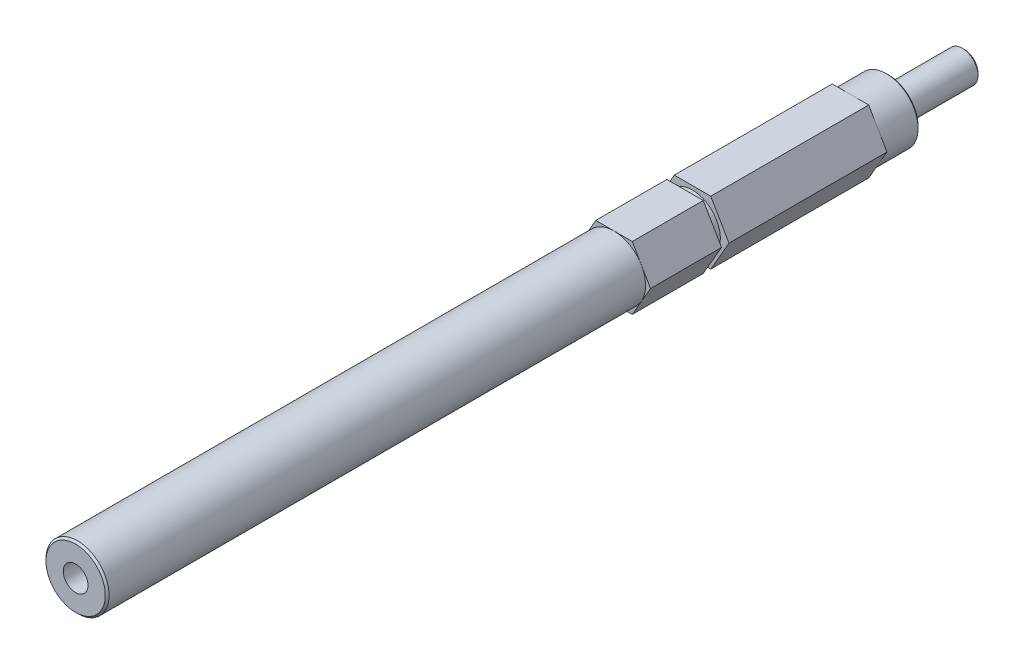
ISO-10303-21;
HEADER;
FILE_DESCRIPTION(('STEP AP214'),'2;1');
FILE_NAME('part.step','',(''),(''),'','','');
FILE_SCHEMA(('AUTOMOTIVE_DESIGN { 1 0 10303 214 1 1 1 1 }'));
ENDSEC;
DATA;
#1=APPLICATION_CONTEXT('core data for automotive mechanical design processes');
#2=APPLICATION_PROTOCOL_DEFINITION('international standard','automotive_design',2000,#1);
#3=PRODUCT_CONTEXT('',#1,'mechanical');
#4=PRODUCT('Part','Part','',(#3));
#5=PRODUCT_RELATED_PRODUCT_CATEGORY('part','',(#4));
#6=PRODUCT_DEFINITION_FORMATION('','',#4);
#7=PRODUCT_DEFINITION_CONTEXT('part definition',#1,'design');
#8=PRODUCT_DEFINITION('design','',#6,#7);
#9=PRODUCT_DEFINITION_SHAPE('','',#8);
#10=(LENGTH_UNIT() NAMED_UNIT(*) SI_UNIT(.MILLI.,.METRE.));
#11=(NAMED_UNIT(*) PLANE_ANGLE_UNIT() SI_UNIT($,.RADIAN.));
#12=(NAMED_UNIT(*) SI_UNIT($,.STERADIAN.) SOLID_ANGLE_UNIT());
#13=UNCERTAINTY_MEASURE_WITH_UNIT(LENGTH_MEASURE(1.E-05),#10,'distance_accuracy_value','');
#14=(GEOMETRIC_REPRESENTATION_CONTEXT(3) GLOBAL_UNCERTAINTY_ASSIGNED_CONTEXT((#13)) GLOBAL_UNIT_ASSIGNED_CONTEXT((#10,
#11,#12)) REPRESENTATION_CONTEXT('',''));
#15=CARTESIAN_POINT('',(0.,0.,0.));
#16=DIRECTION('',(0.,0.,1.));
#17=DIRECTION('',(1.,0.,0.));
#18=AXIS2_PLACEMENT_3D('',#15,#16,#17);
#19=CARTESIAN_POINT('',(9.05330995064486,0.,-22.86));
#20=DIRECTION('',(0.,0.,1.));
#21=DIRECTION('',(1.,0.,0.));
#22=AXIS2_PLACEMENT_3D('',#19,#20,#21);
#23=PLANE('',#22);
#24=CARTESIAN_POINT('',(9.05330995064486,0.,-22.860000000037));
#25=DIRECTION('',(0.,0.,1.));
#26=DIRECTION('',(1.,0.,0.));
#27=AXIS2_PLACEMENT_3D('',#24,#25,#26);
#28=CIRCLE('',#27,2.76859999993877);
#29=CARTESIAN_POINT('',(11.8219099505836,0.,-22.860000000037));
#30=VERTEX_POINT('',#29);
#31=EDGE_CURVE('E20',#30,#30,#28,.T.);
#32=ORIENTED_EDGE('',*,*,#31,.F.);
#33=EDGE_LOOP('',(#32));
#34=FACE_BOUND('',#33,.T.);
#35=ADVANCED_FACE('F17',(#34),#23,.F.);
#36=CARTESIAN_POINT('',(9.05330995064486,0.,-22.4790000000326));
#37=DIRECTION('',(0.,0.,1.));
#38=DIRECTION('',(1.,0.,0.));
#39=AXIS2_PLACEMENT_3D('',#36,#37,#38);
#40=CONICAL_SURFACE('',#39,3.14959999994318,0.785398163397448);
#41=CARTESIAN_POINT('',(9.05330995064486,0.,-22.479));
#42=DIRECTION('',(0.,0.,-1.));
#43=DIRECTION('',(-1.,0.,0.));
#44=AXIS2_PLACEMENT_3D('',#41,#42,#43);
#45=CIRCLE('',#44,3.1496);
#46=CARTESIAN_POINT('',(5.90370995064486,0.,-22.479));
#47=VERTEX_POINT('',#46);
#48=EDGE_CURVE('E159',#47,#47,#45,.F.);
#49=ORIENTED_EDGE('',*,*,#48,.F.);
#50=EDGE_LOOP('',(#49));
#51=FACE_BOUND('',#50,.T.);
#52=ORIENTED_EDGE('',*,*,#31,.T.);
#53=EDGE_LOOP('',(#52));
#54=FACE_BOUND('',#53,.T.);
#55=ADVANCED_FACE('F353',(#51,#54),#40,.T.);
#56=CARTESIAN_POINT('',(9.05330995064486,0.,-22.86));
#57=DIRECTION('',(0.,0.,-1.));
#58=DIRECTION('',(-1.,0.,0.));
#59=AXIS2_PLACEMENT_3D('',#56,#57,#58);
#60=CYLINDRICAL_SURFACE('',#59,3.1496);
#61=CARTESIAN_POINT('',(9.05330995064486,0.,-7.62));
#62=DIRECTION('',(0.,0.,-1.));
#63=DIRECTION('',(-1.,0.,0.));
#64=AXIS2_PLACEMENT_3D('',#61,#62,#63);
#65=CIRCLE('',#64,3.1496);
#66=CARTESIAN_POINT('',(5.90370995064486,0.,-7.62));
#67=VERTEX_POINT('',#66);
#68=EDGE_CURVE('E162',#67,#67,#65,.T.);
#69=ORIENTED_EDGE('',*,*,#68,.T.);
#70=EDGE_LOOP('',(#69));
#71=FACE_BOUND('',#70,.T.);
#72=ORIENTED_EDGE('',*,*,#48,.T.);
#73=EDGE_LOOP('',(#72));
#74=FACE_BOUND('',#73,.T.);
#75=ADVANCED_FACE('F338',(#71,#74),#60,.T.);
#76=CARTESIAN_POINT('',(9.05330995064486,0.,-7.62));
#77=DIRECTION('',(0.,0.,1.));
#78=DIRECTION('',(1.,0.,0.));
#79=AXIS2_PLACEMENT_3D('',#76,#77,#78);
#80=PLANE('',#79);
#81=CARTESIAN_POINT('',(9.05330995064486,0.,-7.61999999997443));
#82=DIRECTION('',(0.,0.,1.));
#83=DIRECTION('',(1.,0.,0.));
#84=AXIS2_PLACEMENT_3D('',#81,#82,#83);
#85=CIRCLE('',#84,5.96264999998613);
#86=CARTESIAN_POINT('',(15.015959950631,0.,-7.61999999997443));
#87=VERTEX_POINT('',#86);
#88=EDGE_CURVE('E156',#87,#87,#85,.T.);
#89=ORIENTED_EDGE('',*,*,#88,.F.);
#90=EDGE_LOOP('',(#89));
#91=FACE_BOUND('',#90,.T.);
#92=ORIENTED_EDGE('',*,*,#68,.F.);
#93=EDGE_LOOP('',(#92));
#94=FACE_BOUND('',#93,.T.);
#95=ADVANCED_FACE('F341',(#91,#94),#80,.F.);
#96=CARTESIAN_POINT('',(9.05330995064486,0.,-7.23899999997002));
#97=DIRECTION('',(0.,0.,1.));
#98=DIRECTION('',(1.,0.,0.));
#99=AXIS2_PLACEMENT_3D('',#96,#97,#98);
#100=CONICAL_SURFACE('',#99,6.34364999999053,0.785398163397448);
#101=CARTESIAN_POINT('',(9.05330995064486,0.,-7.239));
#102=DIRECTION('',(0.,0.,-1.));
#103=DIRECTION('',(-1.,0.,0.));
#104=AXIS2_PLACEMENT_3D('',#101,#102,#103);
#105=CIRCLE('',#104,6.34365);
#106=CARTESIAN_POINT('',(2.70965995064486,0.,-7.239));
#107=VERTEX_POINT('',#106);
#108=EDGE_CURVE('E153',#107,#107,#105,.F.);
#109=ORIENTED_EDGE('',*,*,#108,.F.);
#110=EDGE_LOOP('',(#109));
#111=FACE_BOUND('',#110,.T.);
#112=ORIENTED_EDGE('',*,*,#88,.T.);
#113=EDGE_LOOP('',(#112));
#114=FACE_BOUND('',#113,.T.);
#115=ADVANCED_FACE('F343',(#111,#114),#100,.T.);
#116=CARTESIAN_POINT('',(9.05330995064486,0.,-7.62));
#117=DIRECTION('',(0.,0.,-1.));
#118=DIRECTION('',(-1.,0.,0.));
#119=AXIS2_PLACEMENT_3D('',#116,#117,#118);
#120=CYLINDRICAL_SURFACE('',#119,6.34365);
#121=CARTESIAN_POINT('',(9.05330995064486,0.,0.));
#122=DIRECTION('',(0.,0.,-1.));
#123=DIRECTION('',(-1.,0.,0.));
#124=AXIS2_PLACEMENT_3D('',#121,#122,#123);
#125=CIRCLE('',#124,6.34365);
#126=CARTESIAN_POINT('',(2.70965995064486,0.,0.));
#127=VERTEX_POINT('',#126);
#128=EDGE_CURVE('E135',#127,#127,#125,.T.);
#129=ORIENTED_EDGE('',*,*,#128,.T.);
#130=EDGE_LOOP('',(#129));
#131=FACE_BOUND('',#130,.T.);
#132=ORIENTED_EDGE('',*,*,#108,.T.);
#133=EDGE_LOOP('',(#132));
#134=FACE_BOUND('',#133,.T.);
#135=ADVANCED_FACE('F350',(#131,#134),#120,.T.);
#136=CARTESIAN_POINT('',(12.719484159999,6.35,0.));
#137=DIRECTION('',(0.,0.,1.));
#138=DIRECTION('',(1.,0.,0.));
#139=AXIS2_PLACEMENT_3D('',#136,#137,#138);
#140=PLANE('',#139);
#141=DIRECTION('',(-0.499999999999999,-0.866025403784439,0.));
#142=VECTOR('',#141,1.);
#143=CARTESIAN_POINT('',(12.719484159999,-6.35000000000001,0.));
#144=LINE('',#143,#142);
#145=CARTESIAN_POINT('',(16.3856583693531,0.,0.));
#146=VERTEX_POINT('',#145);
#147=CARTESIAN_POINT('',(12.719484159999,-6.35000000000001,0.));
#148=VERTEX_POINT('',#147);
#149=EDGE_CURVE('E124',#146,#148,#144,.T.);
#150=ORIENTED_EDGE('',*,*,#149,.T.);
#151=DIRECTION('',(1.,0.,0.));
#152=VECTOR('',#151,1.);
#153=CARTESIAN_POINT('',(5.38713574129074,-6.35000000000001,0.));
#154=LINE('',#153,#152);
#155=CARTESIAN_POINT('',(5.38713574129074,-6.35000000000001,0.));
#156=VERTEX_POINT('',#155);
#157=EDGE_CURVE('E144',#148,#156,#154,.F.);
#158=ORIENTED_EDGE('',*,*,#157,.T.);
#159=DIRECTION('',(-0.499999999999999,0.866025403784439,0.));
#160=VECTOR('',#159,1.);
#161=CARTESIAN_POINT('',(1.72096153193662,0.,0.));
#162=LINE('',#161,#160);
#163=CARTESIAN_POINT('',(1.72096153193662,0.,0.));
#164=VERTEX_POINT('',#163);
#165=EDGE_CURVE('E297',#156,#164,#162,.T.);
#166=ORIENTED_EDGE('',*,*,#165,.T.);
#167=DIRECTION('',(0.499999999999999,0.866025403784439,0.));
#168=VECTOR('',#167,1.);
#169=CARTESIAN_POINT('',(5.38713574129074,6.34999999999999,0.));
#170=LINE('',#169,#168);
#171=CARTESIAN_POINT('',(5.38713574129074,6.35,0.));
#172=VERTEX_POINT('',#171);
#173=EDGE_CURVE('E292',#164,#172,#170,.T.);
#174=ORIENTED_EDGE('',*,*,#173,.T.);
#175=DIRECTION('',(1.,0.,0.));
#176=VECTOR('',#175,1.);
#177=CARTESIAN_POINT('',(12.719484159999,6.35,0.));
#178=LINE('',#177,#176);
#179=CARTESIAN_POINT('',(12.719484159999,6.35,0.));
#180=VERTEX_POINT('',#179);
#181=EDGE_CURVE('E132',#172,#180,#178,.T.);
#182=ORIENTED_EDGE('',*,*,#181,.T.);
#183=DIRECTION('',(0.499999999999999,-0.866025403784439,0.));
#184=VECTOR('',#183,1.);
#185=CARTESIAN_POINT('',(16.3856583693531,0.,0.));
#186=LINE('',#185,#184);
#187=EDGE_CURVE('E127',#180,#146,#186,.T.);
#188=ORIENTED_EDGE('',*,*,#187,.T.);
#189=EDGE_LOOP('',(#150,#158,#166,#174,#182,#188));
#190=FACE_BOUND('',#189,.T.);
#191=ORIENTED_EDGE('',*,*,#128,.F.);
#192=EDGE_LOOP('',(#191));
#193=FACE_BOUND('',#192,.T.);
#194=ADVANCED_FACE('F129',(#190,#193),#140,.F.);
#195=CARTESIAN_POINT('',(16.3856583693531,0.,47.5234));
#196=DIRECTION('',(-0.866025403784439,-0.499999999999999,0.));
#197=DIRECTION('',(0.499999999999999,-0.866025403784439,0.));
#198=AXIS2_PLACEMENT_3D('',#195,#196,#197);
#199=PLANE('',#198);
#200=DIRECTION('',(0.499999999999998,-0.86602540378444,0.));
#201=VECTOR('',#200,1.);
#202=CARTESIAN_POINT('',(12.719484159999,6.35,31.75));
#203=LINE('',#202,#201);
#204=CARTESIAN_POINT('',(12.719484159999,6.34999999999999,31.75));
#205=VERTEX_POINT('',#204);
#206=CARTESIAN_POINT('',(16.3856583693531,0.,31.75));
#207=VERTEX_POINT('',#206);
#208=EDGE_CURVE('E141',#205,#207,#203,.T.);
#209=ORIENTED_EDGE('',*,*,#208,.T.);
#210=DIRECTION('',(0.,0.,1.));
#211=VECTOR('',#210,1.);
#212=CARTESIAN_POINT('',(16.3856583693531,0.,47.5234));
#213=LINE('',#212,#211);
#214=EDGE_CURVE('E138',#207,#146,#213,.F.);
#215=ORIENTED_EDGE('',*,*,#214,.T.);
#216=ORIENTED_EDGE('',*,*,#187,.F.);
#217=DIRECTION('',(0.,0.,1.));
#218=VECTOR('',#217,1.);
#219=CARTESIAN_POINT('',(12.719484159999,6.35,47.5234));
#220=LINE('',#219,#218);
#221=EDGE_CURVE('E286',#180,#205,#220,.T.);
#222=ORIENTED_EDGE('',*,*,#221,.T.);
#223=EDGE_LOOP('',(#209,#215,#216,#222));
#224=FACE_BOUND('',#223,.T.);
#225=ADVANCED_FACE('F139',(#224),#199,.F.);
#226=CARTESIAN_POINT('',(12.719484159999,-6.35000000000001,47.5234));
#227=DIRECTION('',(-0.866025403784439,0.499999999999999,0.));
#228=DIRECTION('',(-0.499999999999999,-0.866025403784439,0.));
#229=AXIS2_PLACEMENT_3D('',#226,#227,#228);
#230=PLANE('',#229);
#231=DIRECTION('',(-0.499999999999996,-0.866025403784441,0.));
#232=VECTOR('',#231,1.);
#233=CARTESIAN_POINT('',(16.3856583693531,0.,31.75));
#234=LINE('',#233,#232);
#235=CARTESIAN_POINT('',(12.719484159999,-6.35000000000001,31.75));
#236=VERTEX_POINT('',#235);
#237=EDGE_CURVE('E280',#207,#236,#234,.T.);
#238=ORIENTED_EDGE('',*,*,#237,.T.);
#239=DIRECTION('',(0.,0.,1.));
#240=VECTOR('',#239,1.);
#241=CARTESIAN_POINT('',(12.719484159999,-6.35000000000001,47.5234));
#242=LINE('',#241,#240);
#243=EDGE_CURVE('E148',#236,#148,#242,.F.);
#244=ORIENTED_EDGE('',*,*,#243,.T.);
#245=ORIENTED_EDGE('',*,*,#149,.F.);
#246=ORIENTED_EDGE('',*,*,#214,.F.);
#247=EDGE_LOOP('',(#238,#244,#245,#246));
#248=FACE_BOUND('',#247,.T.);
#249=ADVANCED_FACE('F146',(#248),#230,.F.);
#250=CARTESIAN_POINT('',(5.38713574129074,-6.35000000000001,47.5234));
#251=DIRECTION('',(0.,1.,0.));
#252=DIRECTION('',(0.,0.,1.));
#253=AXIS2_PLACEMENT_3D('',#250,#251,#252);
#254=PLANE('',#253);
#255=DIRECTION('',(-1.,0.,0.));
#256=VECTOR('',#255,1.);
#257=CARTESIAN_POINT('',(42.9726315789473,-6.35000000000001,31.75));
#258=LINE('',#257,#256);
#259=CARTESIAN_POINT('',(5.38713574129074,-6.35000000000001,31.75));
#260=VERTEX_POINT('',#259);
#261=EDGE_CURVE('E278',#236,#260,#258,.T.);
#262=ORIENTED_EDGE('',*,*,#261,.T.);
#263=DIRECTION('',(0.,0.,1.));
#264=VECTOR('',#263,1.);
#265=CARTESIAN_POINT('',(5.38713574129074,-6.35000000000001,47.5234));
#266=LINE('',#265,#264);
#267=EDGE_CURVE('E294',#260,#156,#266,.F.);
#268=ORIENTED_EDGE('',*,*,#267,.T.);
#269=ORIENTED_EDGE('',*,*,#157,.F.);
#270=ORIENTED_EDGE('',*,*,#243,.F.);
#271=EDGE_LOOP('',(#262,#268,#269,#270));
#272=FACE_BOUND('',#271,.T.);
#273=ADVANCED_FACE('F302',(#272),#254,.F.);
#274=CARTESIAN_POINT('',(1.72096153193662,0.,47.5234));
#275=DIRECTION('',(0.866025403784439,0.499999999999999,0.));
#276=DIRECTION('',(-0.499999999999999,0.866025403784439,0.));
#277=AXIS2_PLACEMENT_3D('',#274,#275,#276);
#278=PLANE('',#277);
#279=DIRECTION('',(-0.499999999999999,0.866025403784439,0.));
#280=VECTOR('',#279,1.);
#281=CARTESIAN_POINT('',(5.38713574129074,-6.35000000000001,31.75));
#282=LINE('',#281,#280);
#283=CARTESIAN_POINT('',(1.72096153193662,0.,31.75));
#284=VERTEX_POINT('',#283);
#285=EDGE_CURVE('E276',#260,#284,#282,.T.);
#286=ORIENTED_EDGE('',*,*,#285,.T.);
#287=DIRECTION('',(0.,0.,1.));
#288=VECTOR('',#287,1.);
#289=CARTESIAN_POINT('',(1.72096153193662,0.,47.5234));
#290=LINE('',#289,#288);
#291=EDGE_CURVE('E289',#284,#164,#290,.F.);
#292=ORIENTED_EDGE('',*,*,#291,.T.);
#293=ORIENTED_EDGE('',*,*,#165,.F.);
#294=ORIENTED_EDGE('',*,*,#267,.F.);
#295=EDGE_LOOP('',(#286,#292,#293,#294));
#296=FACE_BOUND('',#295,.T.);
#297=ADVANCED_FACE('F306',(#296),#278,.F.);
#298=CARTESIAN_POINT('',(5.38713574129074,6.34999999999999,47.5234));
#299=DIRECTION('',(0.866025403784439,-0.499999999999999,0.));
#300=DIRECTION('',(0.499999999999999,0.866025403784439,0.));
#301=AXIS2_PLACEMENT_3D('',#298,#299,#300);
#302=PLANE('',#301);
#303=DIRECTION('',(0.5,0.866025403784439,0.));
#304=VECTOR('',#303,1.);
#305=CARTESIAN_POINT('',(1.72096153193662,0.,31.75));
#306=LINE('',#305,#304);
#307=CARTESIAN_POINT('',(5.38713574129074,6.34999999999999,31.75));
#308=VERTEX_POINT('',#307);
#309=EDGE_CURVE('E274',#284,#308,#306,.T.);
#310=ORIENTED_EDGE('',*,*,#309,.T.);
#311=DIRECTION('',(0.,0.,1.));
#312=VECTOR('',#311,1.);
#313=CARTESIAN_POINT('',(5.38713574129074,6.35,47.5234));
#314=LINE('',#313,#312);
#315=EDGE_CURVE('E283',#308,#172,#314,.F.);
#316=ORIENTED_EDGE('',*,*,#315,.T.);
#317=ORIENTED_EDGE('',*,*,#173,.F.);
#318=ORIENTED_EDGE('',*,*,#291,.F.);
#319=EDGE_LOOP('',(#310,#316,#317,#318));
#320=FACE_BOUND('',#319,.T.);
#321=ADVANCED_FACE('F311',(#320),#302,.F.);
#322=CARTESIAN_POINT('',(12.719484159999,6.35,47.5234));
#323=DIRECTION('',(0.,-1.,0.));
#324=DIRECTION('',(1.,0.,0.));
#325=AXIS2_PLACEMENT_3D('',#322,#323,#324);
#326=PLANE('',#325);
#327=DIRECTION('',(-1.,0.,0.));
#328=VECTOR('',#327,1.);
#329=CARTESIAN_POINT('',(42.9726315789473,6.34999999999999,31.75));
#330=LINE('',#329,#328);
#331=EDGE_CURVE('E270',#308,#205,#330,.F.);
#332=ORIENTED_EDGE('',*,*,#331,.T.);
#333=ORIENTED_EDGE('',*,*,#221,.F.);
#334=ORIENTED_EDGE('',*,*,#181,.F.);
#335=ORIENTED_EDGE('',*,*,#315,.F.);
#336=EDGE_LOOP('',(#332,#333,#334,#335));
#337=FACE_BOUND('',#336,.T.);
#338=ADVANCED_FACE('F315',(#337),#326,.F.);
#339=CARTESIAN_POINT('',(42.9726315789473,0.,31.75));
#340=DIRECTION('',(0.,0.,-1.));
#341=DIRECTION('',(-1.,0.,0.));
#342=AXIS2_PLACEMENT_3D('',#339,#340,#341);
#343=PLANE('',#342);
#344=ORIENTED_EDGE('',*,*,#309,.F.);
#345=ORIENTED_EDGE('',*,*,#285,.F.);
#346=ORIENTED_EDGE('',*,*,#261,.F.);
#347=ORIENTED_EDGE('',*,*,#237,.F.);
#348=ORIENTED_EDGE('',*,*,#208,.F.);
#349=ORIENTED_EDGE('',*,*,#331,.F.);
#350=EDGE_LOOP('',(#344,#345,#346,#347,#348,#349));
#351=FACE_BOUND('',#350,.T.);
#352=CARTESIAN_POINT('',(9.05330995064486,0.,31.75));
#353=DIRECTION('',(0.,0.,-1.));
#354=DIRECTION('',(-1.,0.,0.));
#355=AXIS2_PLACEMENT_3D('',#352,#353,#354);
#356=CIRCLE('',#355,5.588);
#357=CARTESIAN_POINT('',(3.46530995064486,0.,31.75));
#358=VERTEX_POINT('',#357);
#359=EDGE_CURVE('E273',#358,#358,#356,.F.);
#360=ORIENTED_EDGE('',*,*,#359,.F.);
#361=EDGE_LOOP('',(#360));
#362=FACE_BOUND('',#361,.T.);
#363=ADVANCED_FACE('F317',(#351,#362),#343,.F.);
#364=CARTESIAN_POINT('',(9.05330995064486,0.,139.8524));
#365=DIRECTION('',(0.,0.,-1.));
#366=DIRECTION('',(-1.,0.,0.));
#367=AXIS2_PLACEMENT_3D('',#364,#365,#366);
#368=PLANE('',#367);
#369=CARTESIAN_POINT('',(9.05330995064486,0.,139.8524));
#370=DIRECTION('',(0.,0.,1.));
#371=DIRECTION('',(1.,0.,0.));
#372=AXIS2_PLACEMENT_3D('',#369,#370,#371);
#373=CIRCLE('',#372,2.48793);
#374=CARTESIAN_POINT('',(11.5412399506449,0.,139.8524));
#375=VERTEX_POINT('',#374);
#376=EDGE_CURVE('E325',#375,#375,#373,.T.);
#377=ORIENTED_EDGE('',*,*,#376,.T.);
#378=EDGE_LOOP('',(#377));
#379=FACE_BOUND('',#378,.T.);
#380=ADVANCED_FACE('F320',(#379),#368,.F.);
#381=CARTESIAN_POINT('',(9.05330995064486,0.,47.5234));
#382=DIRECTION('',(0.,0.,-1.));
#383=DIRECTION('',(-1.,0.,0.));
#384=AXIS2_PLACEMENT_3D('',#381,#382,#383);
#385=CYLINDRICAL_SURFACE('',#384,5.588);
#386=ORIENTED_EDGE('',*,*,#359,.T.);
#387=EDGE_LOOP('',(#386));
#388=FACE_BOUND('',#387,.T.);
#389=CARTESIAN_POINT('',(9.05330995064486,0.,33.2486));
#390=DIRECTION('',(0.,0.,-1.));
#391=DIRECTION('',(-1.,0.,0.));
#392=AXIS2_PLACEMENT_3D('',#389,#390,#391);
#393=CIRCLE('',#392,5.588);
#394=CARTESIAN_POINT('',(3.46530995064486,0.,33.2486));
#395=VERTEX_POINT('',#394);
#396=EDGE_CURVE('E328',#395,#395,#393,.T.);
#397=ORIENTED_EDGE('',*,*,#396,.T.);
#398=EDGE_LOOP('',(#397));
#399=FACE_BOUND('',#398,.T.);
#400=ADVANCED_FACE('F473',(#388,#399),#385,.T.);
#401=CARTESIAN_POINT('',(9.05330995064486,0.,155.7274));
#402=DIRECTION('',(0.,0.,1.));
#403=DIRECTION('',(1.,0.,0.));
#404=AXIS2_PLACEMENT_3D('',#401,#402,#403);
#405=CYLINDRICAL_SURFACE('',#404,2.48793);
#406=CARTESIAN_POINT('',(9.05330995064486,0.,155.7274));
#407=DIRECTION('',(0.,0.,1.));
#408=DIRECTION('',(1.,0.,0.));
#409=AXIS2_PLACEMENT_3D('',#406,#407,#408);
#410=CIRCLE('',#409,2.48793);
#411=CARTESIAN_POINT('',(11.5412399506449,0.,155.7274));
#412=VERTEX_POINT('',#411);
#413=EDGE_CURVE('E266',#412,#412,#410,.F.);
#414=ORIENTED_EDGE('',*,*,#413,.F.);
#415=EDGE_LOOP('',(#414));
#416=FACE_BOUND('',#415,.T.);
#417=ORIENTED_EDGE('',*,*,#376,.F.);
#418=EDGE_LOOP('',(#417));
#419=FACE_BOUND('',#418,.T.);
#420=ADVANCED_FACE('F483',(#416,#419),#405,.F.);
#421=CARTESIAN_POINT('',(14.6413099506449,0.,33.2486));
#422=DIRECTION('',(0.,0.,1.));
#423=DIRECTION('',(1.,0.,0.));
#424=AXIS2_PLACEMENT_3D('',#421,#422,#423);
#425=PLANE('',#424);
#426=ORIENTED_EDGE('',*,*,#396,.F.);
#427=EDGE_LOOP('',(#426));
#428=FACE_BOUND('',#427,.T.);
#429=DIRECTION('',(-0.499999999999999,-0.866025403784439,0.));
#430=VECTOR('',#429,1.);
#431=CARTESIAN_POINT('',(12.719484159999,-6.35000000000001,33.2486));
#432=LINE('',#431,#430);
#433=CARTESIAN_POINT('',(16.3856583693531,0.,33.2486));
#434=VERTEX_POINT('',#433);
#435=CARTESIAN_POINT('',(12.719484159999,-6.35000000000001,33.2486));
#436=VERTEX_POINT('',#435);
#437=EDGE_CURVE('E72',#434,#436,#432,.T.);
#438=ORIENTED_EDGE('',*,*,#437,.T.);
#439=DIRECTION('',(1.,0.,0.));
#440=VECTOR('',#439,1.);
#441=CARTESIAN_POINT('',(5.38713574129074,-6.35000000000001,33.2486));
#442=LINE('',#441,#440);
#443=CARTESIAN_POINT('',(5.38713574129074,-6.35000000000001,33.2486));
#444=VERTEX_POINT('',#443);
#445=EDGE_CURVE('E247',#436,#444,#442,.F.);
#446=ORIENTED_EDGE('',*,*,#445,.T.);
#447=DIRECTION('',(-0.499999999999999,0.866025403784439,0.));
#448=VECTOR('',#447,1.);
#449=CARTESIAN_POINT('',(1.72096153193662,0.,33.2486));
#450=LINE('',#449,#448);
#451=CARTESIAN_POINT('',(1.72096153193662,0.,33.2486));
#452=VERTEX_POINT('',#451);
#453=EDGE_CURVE('E252',#444,#452,#450,.T.);
#454=ORIENTED_EDGE('',*,*,#453,.T.);
#455=DIRECTION('',(0.499999999999999,0.866025403784439,0.));
#456=VECTOR('',#455,1.);
#457=CARTESIAN_POINT('',(5.38713574129074,6.34999999999999,33.2486));
#458=LINE('',#457,#456);
#459=CARTESIAN_POINT('',(5.38713574129074,6.35,33.2486));
#460=VERTEX_POINT('',#459);
#461=EDGE_CURVE('E257',#452,#460,#458,.T.);
#462=ORIENTED_EDGE('',*,*,#461,.T.);
#463=DIRECTION('',(1.,0.,0.));
#464=VECTOR('',#463,1.);
#465=CARTESIAN_POINT('',(12.719484159999,6.35,33.2486));
#466=LINE('',#465,#464);
#467=CARTESIAN_POINT('',(12.719484159999,6.35,33.2486));
#468=VERTEX_POINT('',#467);
#469=EDGE_CURVE('E262',#460,#468,#466,.T.);
#470=ORIENTED_EDGE('',*,*,#469,.T.);
#471=DIRECTION('',(0.499999999999999,-0.866025403784439,0.));
#472=VECTOR('',#471,1.);
#473=CARTESIAN_POINT('',(16.3856583693531,0.,33.2486));
#474=LINE('',#473,#472);
#475=EDGE_CURVE('E264',#468,#434,#474,.T.);
#476=ORIENTED_EDGE('',*,*,#475,.T.);
#477=EDGE_LOOP('',(#438,#446,#454,#462,#470,#476));
#478=FACE_BOUND('',#477,.T.);
#479=ADVANCED_FACE('F492',(#428,#478),#425,.F.);
#480=CARTESIAN_POINT('',(9.05330995064486,0.,155.7274));
#481=DIRECTION('',(0.,0.,1.));
#482=DIRECTION('',(1.,0.,0.));
#483=AXIS2_PLACEMENT_3D('',#480,#481,#482);
#484=PLANE('',#483);
#485=CARTESIAN_POINT('',(9.05330995064486,0.,155.727399999989));
#486=DIRECTION('',(0.,0.,-1.));
#487=DIRECTION('',(-1.,0.,0.));
#488=AXIS2_PLACEMENT_3D('',#485,#486,#487);
#489=CIRCLE('',#488,5.95630000000864);
#490=CARTESIAN_POINT('',(3.09700995063622,0.,155.727399999989));
#491=VERTEX_POINT('',#490);
#492=EDGE_CURVE('E239',#491,#491,#489,.T.);
#493=ORIENTED_EDGE('',*,*,#492,.F.);
#494=EDGE_LOOP('',(#493));
#495=FACE_BOUND('',#494,.T.);
#496=ORIENTED_EDGE('',*,*,#413,.T.);
#497=EDGE_LOOP('',(#496));
#498=FACE_BOUND('',#497,.T.);
#499=ADVANCED_FACE('F502',(#495,#498),#484,.T.);
#500=CARTESIAN_POINT('',(9.05330995064485,-4.69900000000001,153.1874));
#501=DIRECTION('',(0.,-1.,0.));
#502=DIRECTION('',(0.,0.,-1.));
#503=AXIS2_PLACEMENT_3D('',#500,#501,#502);
#504=PLANE('',#503);
#505=CARTESIAN_POINT('',(9.05330995064486,-4.69900000000001,59.2074));
#506=DIRECTION('',(0.,1.,0.));
#507=DIRECTION('',(0.,0.,1.));
#508=AXIS2_PLACEMENT_3D('',#505,#506,#507);
#509=CIRCLE('',#508,1.6256);
#510=CARTESIAN_POINT('',(7.42770995064485,-4.69900000000001,59.2074));
#511=VERTEX_POINT('',#510);
#512=CARTESIAN_POINT('',(10.6789099506449,-4.69900000000001,59.2074));
#513=VERTEX_POINT('',#512);
#514=EDGE_CURVE('E229',#511,#513,#509,.F.);
#515=ORIENTED_EDGE('',*,*,#514,.T.);
#516=DIRECTION('',(0.,0.,-1.));
#517=VECTOR('',#516,1.);
#518=CARTESIAN_POINT('',(10.6789099506449,-4.69900000000001,59.2074));
#519=LINE('',#518,#517);
#520=CARTESIAN_POINT('',(10.6789099506449,-4.69900000000001,153.1874));
#521=VERTEX_POINT('',#520);
#522=EDGE_CURVE('E60',#513,#521,#519,.F.);
#523=ORIENTED_EDGE('',*,*,#522,.T.);
#524=CARTESIAN_POINT('',(9.05330995064485,-4.69900000000001,153.1874));
#525=DIRECTION('',(0.,1.,0.));
#526=DIRECTION('',(0.,0.,1.));
#527=AXIS2_PLACEMENT_3D('',#524,#525,#526);
#528=CIRCLE('',#527,1.62560000000001);
#529=CARTESIAN_POINT('',(7.42770995064484,-4.69900000000001,153.1874));
#530=VERTEX_POINT('',#529);
#531=EDGE_CURVE('E63',#521,#530,#528,.F.);
#532=ORIENTED_EDGE('',*,*,#531,.T.);
#533=DIRECTION('',(0.,0.,1.));
#534=VECTOR('',#533,1.);
#535=CARTESIAN_POINT('',(7.42770995064484,-4.69900000000001,153.1874));
#536=LINE('',#535,#534);
#537=EDGE_CURVE('E268',#530,#511,#536,.F.);
#538=ORIENTED_EDGE('',*,*,#537,.T.);
#539=EDGE_LOOP('',(#515,#523,#532,#538));
#540=FACE_BOUND('',#539,.T.);
#541=ADVANCED_FACE('F512',(#540),#504,.T.);
#542=CARTESIAN_POINT('',(16.3856583693531,0.,47.5234));
#543=DIRECTION('',(-0.866025403784439,-0.499999999999999,0.));
#544=DIRECTION('',(0.499999999999999,-0.866025403784439,0.));
#545=AXIS2_PLACEMENT_3D('',#542,#543,#544);
#546=PLANE('',#545);
#547=ORIENTED_EDGE('',*,*,#475,.F.);
#548=DIRECTION('',(0.,0.,1.));
#549=VECTOR('',#548,1.);
#550=CARTESIAN_POINT('',(12.719484159999,6.35,47.5234));
#551=LINE('',#550,#549);
#552=CARTESIAN_POINT('',(12.719484159999,6.34999999999999,47.5234));
#553=VERTEX_POINT('',#552);
#554=EDGE_CURVE('E259',#468,#553,#551,.T.);
#555=ORIENTED_EDGE('',*,*,#554,.T.);
#556=DIRECTION('',(-0.499999999999997,0.86602540378444,0.));
#557=VECTOR('',#556,1.);
#558=CARTESIAN_POINT('',(16.3856583693531,0.,47.5234));
#559=LINE('',#558,#557);
#560=CARTESIAN_POINT('',(16.3856583693531,0.,47.5234));
#561=VERTEX_POINT('',#560);
#562=EDGE_CURVE('E226',#561,#553,#559,.T.);
#563=ORIENTED_EDGE('',*,*,#562,.F.);
#564=DIRECTION('',(0.,0.,1.));
#565=VECTOR('',#564,1.);
#566=CARTESIAN_POINT('',(16.3856583693531,0.,47.5234));
#567=LINE('',#566,#565);
#568=EDGE_CURVE('E241',#561,#434,#567,.F.);
#569=ORIENTED_EDGE('',*,*,#568,.T.);
#570=EDGE_LOOP('',(#547,#555,#563,#569));
#571=FACE_BOUND('',#570,.T.);
#572=ADVANCED_FACE('F522',(#571),#546,.F.);
#573=CARTESIAN_POINT('',(12.719484159999,6.35,47.5234));
#574=DIRECTION('',(0.,-1.,0.));
#575=DIRECTION('',(1.,0.,0.));
#576=AXIS2_PLACEMENT_3D('',#573,#574,#575);
#577=PLANE('',#576);
#578=ORIENTED_EDGE('',*,*,#469,.F.);
#579=DIRECTION('',(0.,0.,1.));
#580=VECTOR('',#579,1.);
#581=CARTESIAN_POINT('',(5.38713574129074,6.34999999999999,47.5234));
#582=LINE('',#581,#580);
#583=CARTESIAN_POINT('',(5.38713574129074,6.35,47.5234));
#584=VERTEX_POINT('',#583);
#585=EDGE_CURVE('E254',#460,#584,#582,.T.);
#586=ORIENTED_EDGE('',*,*,#585,.T.);
#587=DIRECTION('',(1.,0.,0.));
#588=VECTOR('',#587,1.);
#589=CARTESIAN_POINT('',(12.719484159999,6.35,47.5234));
#590=LINE('',#589,#588);
#591=EDGE_CURVE('E223',#553,#584,#590,.F.);
#592=ORIENTED_EDGE('',*,*,#591,.F.);
#593=ORIENTED_EDGE('',*,*,#554,.F.);
#594=EDGE_LOOP('',(#578,#586,#592,#593));
#595=FACE_BOUND('',#594,.T.);
#596=ADVANCED_FACE('F531',(#595),#577,.F.);
#597=CARTESIAN_POINT('',(5.38713574129074,6.34999999999999,47.5234));
#598=DIRECTION('',(0.866025403784439,-0.499999999999999,0.));
#599=DIRECTION('',(0.499999999999999,0.866025403784439,0.));
#600=AXIS2_PLACEMENT_3D('',#597,#598,#599);
#601=PLANE('',#600);
#602=ORIENTED_EDGE('',*,*,#461,.F.);
#603=DIRECTION('',(0.,0.,1.));
#604=VECTOR('',#603,1.);
#605=CARTESIAN_POINT('',(1.72096153193662,0.,47.5234));
#606=LINE('',#605,#604);
#607=CARTESIAN_POINT('',(1.72096153193662,0.,47.5234));
#608=VERTEX_POINT('',#607);
#609=EDGE_CURVE('E249',#452,#608,#606,.T.);
#610=ORIENTED_EDGE('',*,*,#609,.T.);
#611=DIRECTION('',(-0.5,-0.866025403784439,0.));
#612=VECTOR('',#611,1.);
#613=CARTESIAN_POINT('',(5.38713574129074,6.34999999999999,47.5234));
#614=LINE('',#613,#612);
#615=EDGE_CURVE('E218',#584,#608,#614,.T.);
#616=ORIENTED_EDGE('',*,*,#615,.F.);
#617=ORIENTED_EDGE('',*,*,#585,.F.);
#618=EDGE_LOOP('',(#602,#610,#616,#617));
#619=FACE_BOUND('',#618,.T.);
#620=ADVANCED_FACE('F541',(#619),#601,.F.);
#621=CARTESIAN_POINT('',(1.72096153193662,0.,47.5234));
#622=DIRECTION('',(0.866025403784439,0.499999999999999,0.));
#623=DIRECTION('',(-0.499999999999999,0.866025403784439,0.));
#624=AXIS2_PLACEMENT_3D('',#621,#622,#623);
#625=PLANE('',#624);
#626=ORIENTED_EDGE('',*,*,#453,.F.);
#627=DIRECTION('',(0.,0.,1.));
#628=VECTOR('',#627,1.);
#629=CARTESIAN_POINT('',(5.38713574129074,-6.35000000000001,47.5234));
#630=LINE('',#629,#628);
#631=CARTESIAN_POINT('',(5.38713574129074,-6.35000000000001,47.5234));
#632=VERTEX_POINT('',#631);
#633=EDGE_CURVE('E244',#444,#632,#630,.T.);
#634=ORIENTED_EDGE('',*,*,#633,.T.);
#635=DIRECTION('',(0.499999999999999,-0.866025403784439,0.));
#636=VECTOR('',#635,1.);
#637=CARTESIAN_POINT('',(1.72096153193662,0.,47.5234));
#638=LINE('',#637,#636);
#639=EDGE_CURVE('E210',#608,#632,#638,.T.);
#640=ORIENTED_EDGE('',*,*,#639,.F.);
#641=ORIENTED_EDGE('',*,*,#609,.F.);
#642=EDGE_LOOP('',(#626,#634,#640,#641));
#643=FACE_BOUND('',#642,.T.);
#644=ADVANCED_FACE('F551',(#643),#625,.F.);
#645=CARTESIAN_POINT('',(5.38713574129074,-6.35000000000001,47.5234));
#646=DIRECTION('',(0.,1.,0.));
#647=DIRECTION('',(0.,0.,1.));
#648=AXIS2_PLACEMENT_3D('',#645,#646,#647);
#649=PLANE('',#648);
#650=ORIENTED_EDGE('',*,*,#445,.F.);
#651=DIRECTION('',(0.,0.,1.));
#652=VECTOR('',#651,1.);
#653=CARTESIAN_POINT('',(12.719484159999,-6.35000000000001,47.5234));
#654=LINE('',#653,#652);
#655=CARTESIAN_POINT('',(12.719484159999,-6.35000000000001,47.5234));
#656=VERTEX_POINT('',#655);
#657=EDGE_CURVE('E237',#436,#656,#654,.T.);
#658=ORIENTED_EDGE('',*,*,#657,.T.);
#659=DIRECTION('',(1.,0.,0.));
#660=VECTOR('',#659,1.);
#661=CARTESIAN_POINT('',(12.719484159999,-6.35000000000001,47.5234));
#662=LINE('',#661,#660);
#663=EDGE_CURVE('E203',#632,#656,#662,.T.);
#664=ORIENTED_EDGE('',*,*,#663,.F.);
#665=ORIENTED_EDGE('',*,*,#633,.F.);
#666=EDGE_LOOP('',(#650,#658,#664,#665));
#667=FACE_BOUND('',#666,.T.);
#668=ADVANCED_FACE('F561',(#667),#649,.F.);
#669=CARTESIAN_POINT('',(12.719484159999,-6.35000000000001,47.5234));
#670=DIRECTION('',(-0.866025403784439,0.499999999999999,0.));
#671=DIRECTION('',(-0.499999999999999,-0.866025403784439,0.));
#672=AXIS2_PLACEMENT_3D('',#669,#670,#671);
#673=PLANE('',#672);
#674=ORIENTED_EDGE('',*,*,#437,.F.);
#675=ORIENTED_EDGE('',*,*,#568,.F.);
#676=DIRECTION('',(0.499999999999997,0.86602540378444,0.));
#677=VECTOR('',#676,1.);
#678=CARTESIAN_POINT('',(12.719484159999,-6.35000000000001,47.5234));
#679=LINE('',#678,#677);
#680=EDGE_CURVE('E206',#656,#561,#679,.T.);
#681=ORIENTED_EDGE('',*,*,#680,.F.);
#682=ORIENTED_EDGE('',*,*,#657,.F.);
#683=EDGE_LOOP('',(#674,#675,#681,#682));
#684=FACE_BOUND('',#683,.T.);
#685=ADVANCED_FACE('F571',(#684),#673,.F.);
#686=CARTESIAN_POINT('',(9.05330995064486,0.,155.346399999985));
#687=DIRECTION('',(0.,0.,-1.));
#688=DIRECTION('',(-1.,0.,0.));
#689=AXIS2_PLACEMENT_3D('',#686,#687,#688);
#690=CONICAL_SURFACE('',#689,6.33730000001304,0.785398163397448);
#691=ORIENTED_EDGE('',*,*,#492,.T.);
#692=EDGE_LOOP('',(#691));
#693=FACE_BOUND('',#692,.T.);
#694=CARTESIAN_POINT('',(9.05330995064486,0.,155.3464));
#695=DIRECTION('',(0.,0.,1.));
#696=DIRECTION('',(1.,0.,0.));
#697=AXIS2_PLACEMENT_3D('',#694,#695,#696);
#698=CIRCLE('',#697,6.3373);
#699=CARTESIAN_POINT('',(15.3906099506449,0.,155.3464));
#700=VERTEX_POINT('',#699);
#701=EDGE_CURVE('E216',#700,#700,#698,.F.);
#702=ORIENTED_EDGE('',*,*,#701,.F.);
#703=EDGE_LOOP('',(#702));
#704=FACE_BOUND('',#703,.T.);
#705=ADVANCED_FACE('F580',(#693,#704),#690,.T.);
#706=CARTESIAN_POINT('',(7.42770995064484,-4.69900000000001,153.1874));
#707=DIRECTION('',(-1.,0.,0.));
#708=DIRECTION('',(0.,0.,1.));
#709=AXIS2_PLACEMENT_3D('',#706,#707,#708);
#710=PLANE('',#709);
#711=ORIENTED_EDGE('',*,*,#537,.F.);
#712=DIRECTION('',(0.,1.,0.));
#713=VECTOR('',#712,1.);
#714=CARTESIAN_POINT('',(7.42770995064484,-4.69900000000001,153.1874));
#715=LINE('',#714,#713);
#716=CARTESIAN_POINT('',(7.42770995064484,-6.12525884595908,153.1874));
#717=VERTEX_POINT('',#716);
#718=EDGE_CURVE('E235',#530,#717,#715,.F.);
#719=ORIENTED_EDGE('',*,*,#718,.T.);
#720=DIRECTION('',(0.,0.,1.));
#721=VECTOR('',#720,1.);
#722=CARTESIAN_POINT('',(7.42770995064486,-6.12525884595908,155.7274));
#723=LINE('',#722,#721);
#724=CARTESIAN_POINT('',(7.42770995064486,-6.12525884595908,59.2074));
#725=VERTEX_POINT('',#724);
#726=EDGE_CURVE('E649',#725,#717,#723,.T.);
#727=ORIENTED_EDGE('',*,*,#726,.F.);
#728=DIRECTION('',(0.,1.,0.));
#729=VECTOR('',#728,1.);
#730=CARTESIAN_POINT('',(7.42770995064486,-4.69900000000001,59.2074));
#731=LINE('',#730,#729);
#732=EDGE_CURVE('E230',#725,#511,#731,.T.);
#733=ORIENTED_EDGE('',*,*,#732,.T.);
#734=EDGE_LOOP('',(#711,#719,#727,#733));
#735=FACE_BOUND('',#734,.T.);
#736=ADVANCED_FACE('F590',(#735),#710,.F.);
#737=CARTESIAN_POINT('',(9.05330995064485,-4.69900000000001,153.1874));
#738=DIRECTION('',(0.,1.,0.));
#739=DIRECTION('',(0.,0.,1.));
#740=AXIS2_PLACEMENT_3D('',#737,#738,#739);
#741=CYLINDRICAL_SURFACE('',#740,1.62560000000001);
#742=ORIENTED_EDGE('',*,*,#531,.F.);
#743=DIRECTION('',(0.,1.,0.));
#744=VECTOR('',#743,1.);
#745=CARTESIAN_POINT('',(10.6789099506449,-4.69900000000001,153.1874));
#746=LINE('',#745,#744);
#747=CARTESIAN_POINT('',(10.6789099506448,-6.12525884595909,153.1874));
#748=VERTEX_POINT('',#747);
#749=EDGE_CURVE('E233',#521,#748,#746,.F.);
#750=ORIENTED_EDGE('',*,*,#749,.T.);
#751=CARTESIAN_POINT('',(7.42770995064484,-6.12525884595908,153.1874));
#752=CARTESIAN_POINT('',(7.427709356923,-6.12525572463596,153.232328133842));
#753=CARTESIAN_POINT('',(7.42957371588238,-6.12575378905719,153.2772339628));
#754=CARTESIAN_POINT('',(7.4370055183865,-6.12772007109261,153.366708965035));
#755=CARTESIAN_POINT('',(7.44257231415087,-6.12918811899767,153.411278195824));
#756=CARTESIAN_POINT('',(7.46474379130429,-6.13498786175214,153.543807686749));
#757=CARTESIAN_POINT('',(7.48681993198254,-6.14071552933311,153.630855929943));
#758=CARTESIAN_POINT('',(7.54484287046003,-6.15522380051766,153.799851394095));
#759=CARTESIAN_POINT('',(7.58078794401056,-6.16400402460014,153.881799247686));
#760=CARTESIAN_POINT('',(7.66548326068622,-6.18362289276039,154.038544919588));
#761=CARTESIAN_POINT('',(7.71423724324487,-6.19446213769246,154.113340641193));
#762=CARTESIAN_POINT('',(7.82435939633126,-6.21725582012846,154.255340355153));
#763=CARTESIAN_POINT('',(7.8859682514997,-6.22922872662577,154.322354683686));
#764=CARTESIAN_POINT('',(8.01953877702431,-6.25278181975898,154.445226869575));
#765=CARTESIAN_POINT('',(8.09150210854133,-6.26436194301189,154.501082933379));
#766=CARTESIAN_POINT('',(8.24504943874143,-6.28603024945512,154.600832977073));
#767=CARTESIAN_POINT('',(8.32675956357821,-6.29609393699625,154.644538585742));
#768=CARTESIAN_POINT('',(8.4966645768772,-6.31338241243553,154.717519367783));
#769=CARTESIAN_POINT('',(8.58485813782845,-6.32060777958045,154.746797485839));
#770=CARTESIAN_POINT('',(8.76323972962668,-6.33127481871246,154.78948154322));
#771=CARTESIAN_POINT('',(8.85334547072324,-6.33479368136509,154.803211755179));
#772=CARTESIAN_POINT('',(9.03464753560263,-6.33792060730356,154.815429135107));
#773=CARTESIAN_POINT('',(9.1258437123474,-6.33752919205503,154.813918335581));
#774=CARTESIAN_POINT('',(9.30448175040243,-6.33293662453739,154.795927340174));
#775=CARTESIAN_POINT('',(9.39196154893373,-6.32882467210693,154.779797617636));
#776=CARTESIAN_POINT('',(9.56292795585901,-6.31735751229113,154.733591256352));
#777=CARTESIAN_POINT('',(9.64641438225138,-6.31000215724055,154.703513982599));
#778=CARTESIAN_POINT('',(9.80793839716155,-6.29273968536096,154.629988139085));
#779=CARTESIAN_POINT('',(9.88591734844571,-6.28280921769043,154.586416461424));
#780=CARTESIAN_POINT('',(10.0335764914472,-6.2614712817308,154.487233205307));
#781=CARTESIAN_POINT('',(10.1032553521581,-6.2500635771618,154.431619699835));
#782=CARTESIAN_POINT('',(10.2344219882629,-6.22662956241334,154.308067286425));
#783=CARTESIAN_POINT('',(10.2956214434947,-6.21459488362777,154.239823575298));
#784=CARTESIAN_POINT('',(10.4057880378981,-6.19155488986381,154.093896656453));
#785=CARTESIAN_POINT('',(10.4547518181978,-6.18054985805612,154.016210865427));
#786=CARTESIAN_POINT('',(10.5392590622104,-6.16078145773522,153.853003771495));
#787=CARTESIAN_POINT('',(10.5747221247797,-6.15203161626909,153.767439182241));
#788=CARTESIAN_POINT('',(10.6306233341289,-6.13793929639438,153.591333089219));
#789=CARTESIAN_POINT('',(10.651083979258,-6.13259171738886,153.500799257645));
#790=CARTESIAN_POINT('',(10.6687705118441,-6.12794233764161,153.372461142469));
#791=CARTESIAN_POINT('',(10.6725733421849,-6.12693765639837,153.335528109705));
#792=CARTESIAN_POINT('',(10.6776402668995,-6.12559616583399,153.261535950612));
#793=CARTESIAN_POINT('',(10.6789084360226,-6.12525828456892,153.224477122759));
#794=CARTESIAN_POINT('',(10.6789099506449,-6.12525884595908,153.1874));
#795=B_SPLINE_CURVE_WITH_KNOTS('',3,(#751,#752,#753,#754,#755,#756,#757,#758,#759,#760,#761,
#762,#763,#764,#765,#766,#767,#768,#769,#770,#771,#772,#773,#774,#775,#776,#777,#778,#779,#780,
#781,#782,#783,#784,#785,#786,#787,#788,#789,#790,#791,#792,#793,#794),.UNSPECIFIED.,.F.,.F.,(4,
2,2,2,2,2,2,2,2,2,2,2,2,2,2,2,2,2,2,2,2,4),(0.,0.134699121579091,0.269374682323271,
0.537937691837054,0.806467323131067,1.07507543625937,1.3492554400383,1.62347947945457,
1.90174385607654,2.17995141473649,2.45224307367207,2.72449842090432,2.99039453821166,
3.25630276245624,3.52471208853495,3.79316439908171,4.06922955289034,4.34537040757633,
4.62313096096352,4.90047411448537,5.01182508212069,5.12299689626737),.UNSPECIFIED.);
#796=EDGE_CURVE('E173',#717,#748,#795,.T.);
#797=ORIENTED_EDGE('',*,*,#796,.F.);
#798=ORIENTED_EDGE('',*,*,#718,.F.);
#799=EDGE_LOOP('',(#742,#750,#797,#798));
#800=FACE_BOUND('',#799,.T.);
#801=ADVANCED_FACE('F600',(#800),#741,.F.);
#802=CARTESIAN_POINT('',(10.6789099506449,-4.69900000000001,59.2074));
#803=DIRECTION('',(1.,0.,0.));
#804=DIRECTION('',(0.,0.,-1.));
#805=AXIS2_PLACEMENT_3D('',#802,#803,#804);
#806=PLANE('',#805);
#807=ORIENTED_EDGE('',*,*,#522,.F.);
#808=DIRECTION('',(0.,1.,0.));
#809=VECTOR('',#808,1.);
#810=CARTESIAN_POINT('',(10.6789099506449,-4.69900000000001,59.2074));
#811=LINE('',#810,#809);
#812=CARTESIAN_POINT('',(10.6789099506448,-6.12525884595909,59.2074));
#813=VERTEX_POINT('',#812);
#814=EDGE_CURVE('E35',#513,#813,#811,.F.);
#815=ORIENTED_EDGE('',*,*,#814,.T.);
#816=DIRECTION('',(0.,0.,1.));
#817=VECTOR('',#816,1.);
#818=CARTESIAN_POINT('',(10.6789099506448,-6.1252588459591,155.7274));
#819=LINE('',#818,#817);
#820=EDGE_CURVE('E172',#748,#813,#819,.F.);
#821=ORIENTED_EDGE('',*,*,#820,.F.);
#822=ORIENTED_EDGE('',*,*,#749,.F.);
#823=EDGE_LOOP('',(#807,#815,#821,#822));
#824=FACE_BOUND('',#823,.T.);
#825=ADVANCED_FACE('F195',(#824),#806,.F.);
#826=CARTESIAN_POINT('',(9.05330995064486,-4.69900000000001,59.2074));
#827=DIRECTION('',(0.,1.,0.));
#828=DIRECTION('',(0.,0.,1.));
#829=AXIS2_PLACEMENT_3D('',#826,#827,#828);
#830=CYLINDRICAL_SURFACE('',#829,1.6256);
#831=ORIENTED_EDGE('',*,*,#514,.F.);
#832=ORIENTED_EDGE('',*,*,#732,.F.);
#833=CARTESIAN_POINT('',(10.6789099506449,-6.12525884595908,59.2074));
#834=CARTESIAN_POINT('',(10.6789105443667,-6.12525572463597,59.1624718661579));
#835=CARTESIAN_POINT('',(10.6770461854073,-6.12575378905719,59.1175660372002));
#836=CARTESIAN_POINT('',(10.6696143829032,-6.12772007109261,59.0280910349654));
#837=CARTESIAN_POINT('',(10.6640475871388,-6.12918811899768,58.9835218041762));
#838=CARTESIAN_POINT('',(10.6418761099854,-6.13498786175214,58.8509923132512));
#839=CARTESIAN_POINT('',(10.6197999693072,-6.14071552933311,58.763944070057));
#840=CARTESIAN_POINT('',(10.5617770308297,-6.15522380051766,58.5949486059051));
#841=CARTESIAN_POINT('',(10.5258319572791,-6.16400402460014,58.5130007523139));
#842=CARTESIAN_POINT('',(10.4411366406035,-6.1836228927604,58.3562550804123));
#843=CARTESIAN_POINT('',(10.3923826580448,-6.19446213769247,58.2814593588075));
#844=CARTESIAN_POINT('',(10.2822605049584,-6.21725582012847,58.1394596448473));
#845=CARTESIAN_POINT('',(10.22065164979,-6.22922872662577,58.0724453163144));
#846=CARTESIAN_POINT('',(10.0870811242654,-6.25278181975898,57.9495731304249));
#847=CARTESIAN_POINT('',(10.0151177927484,-6.26436194301189,57.8937170666208));
#848=CARTESIAN_POINT('',(9.86157046254826,-6.28603024945513,57.7939670229274));
#849=CARTESIAN_POINT('',(9.77986033771148,-6.29609393699625,57.7502614142581));
#850=CARTESIAN_POINT('',(9.6099553244125,-6.31338241243554,57.6772806322174));
#851=CARTESIAN_POINT('',(9.52176176346126,-6.32060777958045,57.6480025141613));
#852=CARTESIAN_POINT('',(9.34338017166303,-6.33127481871246,57.6053184567802));
#853=CARTESIAN_POINT('',(9.25327443056647,-6.33479368136509,57.5915882448207));
#854=CARTESIAN_POINT('',(9.07197236568707,-6.33792060730356,57.579370864893));
#855=CARTESIAN_POINT('',(8.9807761889423,-6.33752919205503,57.5808816644189));
#856=CARTESIAN_POINT('',(8.80213815088727,-6.33293662453739,57.598872659826));
#857=CARTESIAN_POINT('',(8.71465835235598,-6.32882467210693,57.6150023823637));
#858=CARTESIAN_POINT('',(8.5436919454307,-6.31735751229113,57.6612087436485));
#859=CARTESIAN_POINT('',(8.46020551903833,-6.31000215724055,57.6912860174013));
#860=CARTESIAN_POINT('',(8.29868150412815,-6.29273968536095,57.7648118609152));
#861=CARTESIAN_POINT('',(8.220702552844,-6.28280921769043,57.8083835385756));
#862=CARTESIAN_POINT('',(8.07304340984249,-6.2614712817308,57.9075667946928));
#863=CARTESIAN_POINT('',(8.00336454913161,-6.2500635771618,57.9631803001647));
#864=CARTESIAN_POINT('',(7.87219791302684,-6.22662956241334,58.0867327135745));
#865=CARTESIAN_POINT('',(7.81099845779501,-6.21459488362776,58.1549764247018));
#866=CARTESIAN_POINT('',(7.70083186339165,-6.19155488986381,58.3009033435467));
#867=CARTESIAN_POINT('',(7.65186808309188,-6.18054985805612,58.3785891345731));
#868=CARTESIAN_POINT('',(7.56736083907934,-6.16078145773521,58.5417962285048));
#869=CARTESIAN_POINT('',(7.53189777651001,-6.15203161626909,58.6273608177586));
#870=CARTESIAN_POINT('',(7.47599656716085,-6.13793929639438,58.803466910781));
#871=CARTESIAN_POINT('',(7.45553592203168,-6.13259171738886,58.8940007423551));
#872=CARTESIAN_POINT('',(7.43784938944565,-6.12794233764161,59.0223388575311));
#873=CARTESIAN_POINT('',(7.43404655910481,-6.12693765639837,59.0592718902946));
#874=CARTESIAN_POINT('',(7.42897963439018,-6.12559616583399,59.133264049388));
#875=CARTESIAN_POINT('',(7.42771146526713,-6.12525828456892,59.1703228772407));
#876=CARTESIAN_POINT('',(7.42770995064486,-6.12525884595908,59.2074));
#877=B_SPLINE_CURVE_WITH_KNOTS('',3,(#833,#834,#835,#836,#837,#838,#839,#840,#841,#842,#843,
#844,#845,#846,#847,#848,#849,#850,#851,#852,#853,#854,#855,#856,#857,#858,#859,#860,#861,#862,
#863,#864,#865,#866,#867,#868,#869,#870,#871,#872,#873,#874,#875,#876),.UNSPECIFIED.,.F.,.F.,(4,
2,2,2,2,2,2,2,2,2,2,2,2,2,2,2,2,2,2,2,2,4),(0.,0.134699121579077,0.26937468232325,
0.537937691837054,0.806467323131063,1.07507543625936,1.34925544003829,1.62347947945456,
1.90174385607652,2.17995141473647,2.45224307367205,2.72449842090431,2.99039453821164,
3.25630276245621,3.52471208853492,3.79316439908168,4.06922955289034,4.34537040757631,
4.6231309609635,4.90047411448535,5.01182508212071,5.12299689626733),.UNSPECIFIED.);
#878=EDGE_CURVE('E26',#813,#725,#877,.T.);
#879=ORIENTED_EDGE('',*,*,#878,.F.);
#880=ORIENTED_EDGE('',*,*,#814,.F.);
#881=EDGE_LOOP('',(#831,#832,#879,#880));
#882=FACE_BOUND('',#881,.T.);
#883=ADVANCED_FACE('F179',(#882),#830,.F.);
#884=CARTESIAN_POINT('',(12.719484159999,6.35,47.5234));
#885=DIRECTION('',(0.,0.,1.));
#886=DIRECTION('',(1.,0.,0.));
#887=AXIS2_PLACEMENT_3D('',#884,#885,#886);
#888=PLANE('',#887);
#889=CARTESIAN_POINT('',(9.05330995064486,0.,47.5234));
#890=DIRECTION('',(0.,0.,1.));
#891=DIRECTION('',(1.,0.,0.));
#892=AXIS2_PLACEMENT_3D('',#889,#890,#891);
#893=CIRCLE('',#892,6.3373);
#894=CARTESIAN_POINT('',(15.3906099506449,0.,47.5234));
#895=VERTEX_POINT('',#894);
#896=EDGE_CURVE('E11',#895,#895,#893,.T.);
#897=ORIENTED_EDGE('',*,*,#896,.F.);
#898=EDGE_LOOP('',(#897));
#899=FACE_BOUND('',#898,.T.);
#900=ORIENTED_EDGE('',*,*,#663,.T.);
#901=ORIENTED_EDGE('',*,*,#680,.T.);
#902=ORIENTED_EDGE('',*,*,#562,.T.);
#903=ORIENTED_EDGE('',*,*,#591,.T.);
#904=ORIENTED_EDGE('',*,*,#615,.T.);
#905=ORIENTED_EDGE('',*,*,#639,.T.);
#906=EDGE_LOOP('',(#900,#901,#902,#903,#904,#905));
#907=FACE_BOUND('',#906,.T.);
#908=ADVANCED_FACE('F186',(#899,#907),#888,.T.);
#909=CARTESIAN_POINT('',(9.05330995064486,0.,155.7274));
#910=DIRECTION('',(0.,0.,1.));
#911=DIRECTION('',(1.,0.,0.));
#912=AXIS2_PLACEMENT_3D('',#909,#910,#911);
#913=CYLINDRICAL_SURFACE('',#912,6.3373);
#914=ORIENTED_EDGE('',*,*,#896,.T.);
#915=EDGE_LOOP('',(#914));
#916=FACE_BOUND('',#915,.T.);
#917=ORIENTED_EDGE('',*,*,#820,.T.);
#918=ORIENTED_EDGE('',*,*,#878,.T.);
#919=ORIENTED_EDGE('',*,*,#726,.T.);
#920=ORIENTED_EDGE('',*,*,#796,.T.);
#921=EDGE_LOOP('',(#917,#918,#919,#920));
#922=FACE_BOUND('',#921,.T.);
#923=ORIENTED_EDGE('',*,*,#701,.T.);
#924=EDGE_LOOP('',(#923));
#925=FACE_BOUND('',#924,.T.);
#926=ADVANCED_FACE('F183',(#916,#922,#925),#913,.T.);
#927=CLOSED_SHELL('',(#35,#55,#75,#95,#115,#135,#194,#225,#249,#273,#297,#321,#338,#363,#380,
#400,#420,#479,#499,#541,#572,#596,#620,#644,#668,#685,#705,#736,#801,#825,#883,#908,#926));
#928=MANIFOLD_SOLID_BREP('B1',#927);
#929=ADVANCED_BREP_SHAPE_REPRESENTATION('',(#18,#928),#14);
#930=SHAPE_DEFINITION_REPRESENTATION(#9,#929);
ENDSEC;
END-ISO-10303-21;
